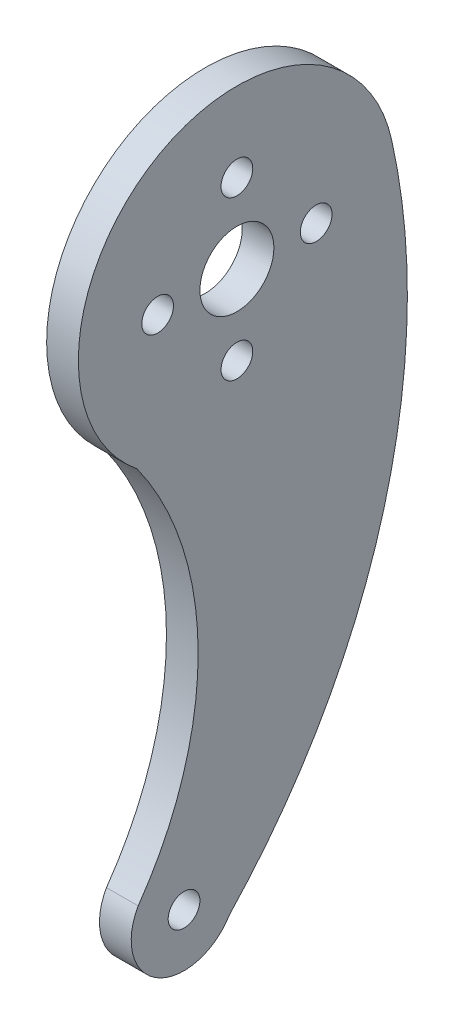
ISO-10303-21;
HEADER;
FILE_DESCRIPTION(('STEP AP214'),'2;1');
FILE_NAME('part.step','',(''),(''),'','','');
FILE_SCHEMA(('AUTOMOTIVE_DESIGN { 1 0 10303 214 1 1 1 1 }'));
ENDSEC;
DATA;
#1=APPLICATION_CONTEXT('core data for automotive mechanical design processes');
#2=APPLICATION_PROTOCOL_DEFINITION('international standard','automotive_design',2000,#1);
#3=PRODUCT_CONTEXT('',#1,'mechanical');
#4=PRODUCT('Part','Part','',(#3));
#5=PRODUCT_RELATED_PRODUCT_CATEGORY('part','',(#4));
#6=PRODUCT_DEFINITION_FORMATION('','',#4);
#7=PRODUCT_DEFINITION_CONTEXT('part definition',#1,'design');
#8=PRODUCT_DEFINITION('design','',#6,#7);
#9=PRODUCT_DEFINITION_SHAPE('','',#8);
#10=(LENGTH_UNIT() NAMED_UNIT(*) SI_UNIT(.MILLI.,.METRE.));
#11=(NAMED_UNIT(*) PLANE_ANGLE_UNIT() SI_UNIT($,.RADIAN.));
#12=(NAMED_UNIT(*) SI_UNIT($,.STERADIAN.) SOLID_ANGLE_UNIT());
#13=UNCERTAINTY_MEASURE_WITH_UNIT(LENGTH_MEASURE(1.E-05),#10,'distance_accuracy_value','');
#14=(GEOMETRIC_REPRESENTATION_CONTEXT(3) GLOBAL_UNCERTAINTY_ASSIGNED_CONTEXT((#13)) GLOBAL_UNIT_ASSIGNED_CONTEXT((#10,
#11,#12)) REPRESENTATION_CONTEXT('',''));
#15=CARTESIAN_POINT('',(0.,0.,0.));
#16=DIRECTION('',(0.,0.,1.));
#17=DIRECTION('',(1.,0.,0.));
#18=AXIS2_PLACEMENT_3D('',#15,#16,#17);
#19=CARTESIAN_POINT('',(3.,-14.8299747003115,17.3003797586799));
#20=DIRECTION('',(1.,0.,0.));
#21=DIRECTION('',(0.,0.,-1.));
#22=AXIS2_PLACEMENT_3D('',#19,#20,#21);
#23=PLANE('',#22);
#24=CARTESIAN_POINT('',(3.,0.,-7.5));
#25=DIRECTION('',(1.,0.,0.));
#26=DIRECTION('',(0.,0.,-1.));
#27=AXIS2_PLACEMENT_3D('',#24,#25,#26);
#28=CIRCLE('',#27,1.5);
#29=CARTESIAN_POINT('',(3.,0.,-9.));
#30=VERTEX_POINT('',#29);
#31=EDGE_CURVE('E132',#30,#30,#28,.T.);
#32=ORIENTED_EDGE('',*,*,#31,.F.);
#33=EDGE_LOOP('',(#32));
#34=FACE_BOUND('',#33,.T.);
#35=CARTESIAN_POINT('',(3.,0.,7.5));
#36=DIRECTION('',(1.,0.,0.));
#37=DIRECTION('',(0.,0.,-1.));
#38=AXIS2_PLACEMENT_3D('',#35,#36,#37);
#39=CIRCLE('',#38,1.5);
#40=CARTESIAN_POINT('',(3.,0.,6.));
#41=VERTEX_POINT('',#40);
#42=EDGE_CURVE('E120',#41,#41,#39,.T.);
#43=ORIENTED_EDGE('',*,*,#42,.F.);
#44=EDGE_LOOP('',(#43));
#45=FACE_BOUND('',#44,.T.);
#46=CARTESIAN_POINT('',(3.,0.,0.));
#47=DIRECTION('',(1.,0.,0.));
#48=DIRECTION('',(0.,0.,-1.));
#49=AXIS2_PLACEMENT_3D('',#46,#47,#48);
#50=CIRCLE('',#49,3.5);
#51=CARTESIAN_POINT('',(3.,0.,-3.5));
#52=VERTEX_POINT('',#51);
#53=EDGE_CURVE('E99',#52,#52,#50,.T.);
#54=ORIENTED_EDGE('',*,*,#53,.F.);
#55=EDGE_LOOP('',(#54));
#56=FACE_BOUND('',#55,.T.);
#57=CARTESIAN_POINT('',(3.,-29.659949400623,34.6007595173598));
#58=DIRECTION('',(-1.,0.,0.));
#59=DIRECTION('',(0.,0.,-1.));
#60=AXIS2_PLACEMENT_3D('',#57,#58,#59);
#61=CIRCLE('',#60,30.9348802246162);
#62=CARTESIAN_POINT('',(3.,-11.649280310313,9.44956444772743));
#63=VERTEX_POINT('',#62);
#64=CARTESIAN_POINT('',(3.,-47.5142601565081,9.33832887532466));
#65=VERTEX_POINT('',#64);
#66=EDGE_CURVE('E84',#63,#65,#61,.T.);
#67=ORIENTED_EDGE('',*,*,#66,.T.);
#68=CARTESIAN_POINT('',(3.,-50.,4.99999999999987));
#69=DIRECTION('',(1.,0.,0.));
#70=DIRECTION('',(0.,0.,-1.));
#71=AXIS2_PLACEMENT_3D('',#68,#69,#70);
#72=CIRCLE('',#71,5.);
#73=CARTESIAN_POINT('',(3.,-52.5694897812166,0.710743390256941));
#74=VERTEX_POINT('',#73);
#75=EDGE_CURVE('E79',#65,#74,#72,.T.);
#76=ORIENTED_EDGE('',*,*,#75,.T.);
#77=CARTESIAN_POINT('',(3.,-10.2016384064253,45.5953037460277));
#78=DIRECTION('',(1.,0.,0.));
#79=DIRECTION('',(0.,0.,1.));
#80=AXIS2_PLACEMENT_3D('',#77,#78,#79);
#81=CIRCLE('',#80,61.7224318092477);
#82=CARTESIAN_POINT('',(3.,3.18632775266012,-14.6576708740723));
#83=VERTEX_POINT('',#82);
#84=EDGE_CURVE('E82',#74,#83,#81,.T.);
#85=ORIENTED_EDGE('',*,*,#84,.T.);
#86=CARTESIAN_POINT('',(3.,0.,0.));
#87=DIRECTION('',(1.,0.,0.));
#88=DIRECTION('',(0.,0.,-1.));
#89=AXIS2_PLACEMENT_3D('',#86,#87,#88);
#90=CIRCLE('',#89,15.);
#91=EDGE_CURVE('E49',#83,#63,#90,.T.);
#92=ORIENTED_EDGE('',*,*,#91,.T.);
#93=EDGE_LOOP('',(#67,#76,#85,#92));
#94=FACE_BOUND('',#93,.T.);
#95=CARTESIAN_POINT('',(3.,-50.,4.99999999999987));
#96=DIRECTION('',(1.,0.,0.));
#97=DIRECTION('',(0.,0.,-1.));
#98=AXIS2_PLACEMENT_3D('',#95,#96,#97);
#99=CIRCLE('',#98,1.5);
#100=CARTESIAN_POINT('',(3.,-50.,3.49999999999987));
#101=VERTEX_POINT('',#100);
#102=EDGE_CURVE('E114',#101,#101,#99,.T.);
#103=ORIENTED_EDGE('',*,*,#102,.F.);
#104=EDGE_LOOP('',(#103));
#105=FACE_BOUND('',#104,.T.);
#106=CARTESIAN_POINT('',(3.,7.5,0.));
#107=DIRECTION('',(1.,0.,0.));
#108=DIRECTION('',(0.,0.,-1.));
#109=AXIS2_PLACEMENT_3D('',#106,#107,#108);
#110=CIRCLE('',#109,1.5);
#111=CARTESIAN_POINT('',(3.,7.5,-1.5));
#112=VERTEX_POINT('',#111);
#113=EDGE_CURVE('E126',#112,#112,#110,.T.);
#114=ORIENTED_EDGE('',*,*,#113,.F.);
#115=EDGE_LOOP('',(#114));
#116=FACE_BOUND('',#115,.T.);
#117=CARTESIAN_POINT('',(3.,-7.5,0.));
#118=DIRECTION('',(1.,0.,0.));
#119=DIRECTION('',(0.,0.,-1.));
#120=AXIS2_PLACEMENT_3D('',#117,#118,#119);
#121=CIRCLE('',#120,1.5);
#122=CARTESIAN_POINT('',(3.,-7.5,-1.5));
#123=VERTEX_POINT('',#122);
#124=EDGE_CURVE('E138',#123,#123,#121,.T.);
#125=ORIENTED_EDGE('',*,*,#124,.F.);
#126=EDGE_LOOP('',(#125));
#127=FACE_BOUND('',#126,.T.);
#128=ADVANCED_FACE('F32',(#34,#45,#56,#94,#105,#116,#127),#23,.T.);
#129=CARTESIAN_POINT('',(0.,-14.8299747003115,17.3003797586799));
#130=DIRECTION('',(1.,0.,0.));
#131=DIRECTION('',(0.,0.,-1.));
#132=AXIS2_PLACEMENT_3D('',#129,#130,#131);
#133=PLANE('',#132);
#134=CARTESIAN_POINT('',(0.,0.,-7.5));
#135=DIRECTION('',(1.,0.,0.));
#136=DIRECTION('',(0.,0.,-1.));
#137=AXIS2_PLACEMENT_3D('',#134,#135,#136);
#138=CIRCLE('',#137,1.5);
#139=CARTESIAN_POINT('',(0.,0.,-9.));
#140=VERTEX_POINT('',#139);
#141=EDGE_CURVE('E135',#140,#140,#138,.T.);
#142=ORIENTED_EDGE('',*,*,#141,.T.);
#143=EDGE_LOOP('',(#142));
#144=FACE_BOUND('',#143,.T.);
#145=CARTESIAN_POINT('',(0.,0.,7.5));
#146=DIRECTION('',(1.,0.,0.));
#147=DIRECTION('',(0.,0.,-1.));
#148=AXIS2_PLACEMENT_3D('',#145,#146,#147);
#149=CIRCLE('',#148,1.5);
#150=CARTESIAN_POINT('',(0.,0.,6.));
#151=VERTEX_POINT('',#150);
#152=EDGE_CURVE('E123',#151,#151,#149,.T.);
#153=ORIENTED_EDGE('',*,*,#152,.T.);
#154=EDGE_LOOP('',(#153));
#155=FACE_BOUND('',#154,.T.);
#156=CARTESIAN_POINT('',(0.,0.,0.));
#157=DIRECTION('',(1.,0.,0.));
#158=DIRECTION('',(0.,0.,-1.));
#159=AXIS2_PLACEMENT_3D('',#156,#157,#158);
#160=CIRCLE('',#159,3.5);
#161=CARTESIAN_POINT('',(0.,0.,-3.5));
#162=VERTEX_POINT('',#161);
#163=EDGE_CURVE('E111',#162,#162,#160,.T.);
#164=ORIENTED_EDGE('',*,*,#163,.T.);
#165=EDGE_LOOP('',(#164));
#166=FACE_BOUND('',#165,.T.);
#167=CARTESIAN_POINT('',(0.,-29.659949400623,34.6007595173598));
#168=DIRECTION('',(-1.,0.,0.));
#169=DIRECTION('',(0.,0.,-1.));
#170=AXIS2_PLACEMENT_3D('',#167,#168,#169);
#171=CIRCLE('',#170,30.9348802246162);
#172=CARTESIAN_POINT('',(0.,-11.649280310313,9.44956444772743));
#173=VERTEX_POINT('',#172);
#174=CARTESIAN_POINT('',(0.,-47.5142601565081,9.33832887532466));
#175=VERTEX_POINT('',#174);
#176=EDGE_CURVE('E96',#173,#175,#171,.T.);
#177=ORIENTED_EDGE('',*,*,#176,.F.);
#178=CARTESIAN_POINT('',(0.,0.,0.));
#179=DIRECTION('',(1.,0.,0.));
#180=DIRECTION('',(0.,0.,-1.));
#181=AXIS2_PLACEMENT_3D('',#178,#179,#180);
#182=CIRCLE('',#181,15.);
#183=CARTESIAN_POINT('',(0.,3.18632775266012,-14.6576708740723));
#184=VERTEX_POINT('',#183);
#185=EDGE_CURVE('E72',#184,#173,#182,.T.);
#186=ORIENTED_EDGE('',*,*,#185,.F.);
#187=CARTESIAN_POINT('',(0.,-10.2016384064253,45.5953037460277));
#188=DIRECTION('',(1.,0.,0.));
#189=DIRECTION('',(0.,0.,1.));
#190=AXIS2_PLACEMENT_3D('',#187,#188,#189);
#191=CIRCLE('',#190,61.7224318092477);
#192=CARTESIAN_POINT('',(0.,-52.5694897812166,0.710743390256941));
#193=VERTEX_POINT('',#192);
#194=EDGE_CURVE('E66',#193,#184,#191,.T.);
#195=ORIENTED_EDGE('',*,*,#194,.F.);
#196=CARTESIAN_POINT('',(0.,-50.,4.99999999999987));
#197=DIRECTION('',(1.,0.,0.));
#198=DIRECTION('',(0.,0.,-1.));
#199=AXIS2_PLACEMENT_3D('',#196,#197,#198);
#200=CIRCLE('',#199,5.);
#201=EDGE_CURVE('E88',#175,#193,#200,.T.);
#202=ORIENTED_EDGE('',*,*,#201,.F.);
#203=EDGE_LOOP('',(#177,#186,#195,#202));
#204=FACE_BOUND('',#203,.T.);
#205=CARTESIAN_POINT('',(0.,-50.,4.99999999999987));
#206=DIRECTION('',(1.,0.,0.));
#207=DIRECTION('',(0.,0.,-1.));
#208=AXIS2_PLACEMENT_3D('',#205,#206,#207);
#209=CIRCLE('',#208,1.5);
#210=CARTESIAN_POINT('',(0.,-50.,3.49999999999987));
#211=VERTEX_POINT('',#210);
#212=EDGE_CURVE('E117',#211,#211,#209,.T.);
#213=ORIENTED_EDGE('',*,*,#212,.T.);
#214=EDGE_LOOP('',(#213));
#215=FACE_BOUND('',#214,.T.);
#216=CARTESIAN_POINT('',(0.,7.5,0.));
#217=DIRECTION('',(1.,0.,0.));
#218=DIRECTION('',(0.,0.,-1.));
#219=AXIS2_PLACEMENT_3D('',#216,#217,#218);
#220=CIRCLE('',#219,1.5);
#221=CARTESIAN_POINT('',(0.,7.5,-1.5));
#222=VERTEX_POINT('',#221);
#223=EDGE_CURVE('E129',#222,#222,#220,.T.);
#224=ORIENTED_EDGE('',*,*,#223,.T.);
#225=EDGE_LOOP('',(#224));
#226=FACE_BOUND('',#225,.T.);
#227=CARTESIAN_POINT('',(0.,-7.5,0.));
#228=DIRECTION('',(1.,0.,0.));
#229=DIRECTION('',(0.,0.,-1.));
#230=AXIS2_PLACEMENT_3D('',#227,#228,#229);
#231=CIRCLE('',#230,1.5);
#232=CARTESIAN_POINT('',(0.,-7.5,-1.5));
#233=VERTEX_POINT('',#232);
#234=EDGE_CURVE('E141',#233,#233,#231,.T.);
#235=ORIENTED_EDGE('',*,*,#234,.T.);
#236=EDGE_LOOP('',(#235));
#237=FACE_BOUND('',#236,.T.);
#238=ADVANCED_FACE('F107',(#144,#155,#166,#204,#215,#226,#237),#133,.F.);
#239=CARTESIAN_POINT('',(3.,-29.659949400623,34.6007595173598));
#240=DIRECTION('',(-1.,0.,0.));
#241=DIRECTION('',(0.,0.,1.));
#242=AXIS2_PLACEMENT_3D('',#239,#240,#241);
#243=CYLINDRICAL_SURFACE('',#242,30.9348802246162);
#244=ORIENTED_EDGE('',*,*,#176,.T.);
#245=DIRECTION('',(-1.,0.,0.));
#246=VECTOR('',#245,1.);
#247=CARTESIAN_POINT('',(3.,-47.5142601565081,9.33832887532466));
#248=LINE('',#247,#246);
#249=EDGE_CURVE('E11',#65,#175,#248,.T.);
#250=ORIENTED_EDGE('',*,*,#249,.F.);
#251=ORIENTED_EDGE('',*,*,#66,.F.);
#252=DIRECTION('',(-1.,0.,0.));
#253=VECTOR('',#252,1.);
#254=CARTESIAN_POINT('',(3.,-11.649280310313,9.44956444772743));
#255=LINE('',#254,#253);
#256=EDGE_CURVE('E92',#63,#173,#255,.T.);
#257=ORIENTED_EDGE('',*,*,#256,.T.);
#258=EDGE_LOOP('',(#244,#250,#251,#257));
#259=FACE_BOUND('',#258,.T.);
#260=ADVANCED_FACE('F34',(#259),#243,.F.);
#261=CARTESIAN_POINT('',(3.,-50.,4.99999999999987));
#262=DIRECTION('',(-1.,0.,0.));
#263=DIRECTION('',(0.,0.,1.));
#264=AXIS2_PLACEMENT_3D('',#261,#262,#263);
#265=CYLINDRICAL_SURFACE('',#264,5.);
#266=ORIENTED_EDGE('',*,*,#201,.T.);
#267=DIRECTION('',(-1.,0.,0.));
#268=VECTOR('',#267,1.);
#269=CARTESIAN_POINT('',(3.,-52.5694897812166,0.710743390256941));
#270=LINE('',#269,#268);
#271=EDGE_CURVE('E41',#74,#193,#270,.T.);
#272=ORIENTED_EDGE('',*,*,#271,.F.);
#273=ORIENTED_EDGE('',*,*,#75,.F.);
#274=ORIENTED_EDGE('',*,*,#249,.T.);
#275=EDGE_LOOP('',(#266,#272,#273,#274));
#276=FACE_BOUND('',#275,.T.);
#277=ADVANCED_FACE('F87',(#276),#265,.T.);
#278=CARTESIAN_POINT('',(3.,-10.2016384064253,45.5953037460277));
#279=DIRECTION('',(-1.,0.,0.));
#280=DIRECTION('',(0.,0.,1.));
#281=AXIS2_PLACEMENT_3D('',#278,#279,#280);
#282=CYLINDRICAL_SURFACE('',#281,61.7224318092477);
#283=ORIENTED_EDGE('',*,*,#194,.T.);
#284=DIRECTION('',(-1.,0.,0.));
#285=VECTOR('',#284,1.);
#286=CARTESIAN_POINT('',(3.,3.18632775266012,-14.6576708740723));
#287=LINE('',#286,#285);
#288=EDGE_CURVE('E89',#83,#184,#287,.T.);
#289=ORIENTED_EDGE('',*,*,#288,.F.);
#290=ORIENTED_EDGE('',*,*,#84,.F.);
#291=ORIENTED_EDGE('',*,*,#271,.T.);
#292=EDGE_LOOP('',(#283,#289,#290,#291));
#293=FACE_BOUND('',#292,.T.);
#294=ADVANCED_FACE('F90',(#293),#282,.T.);
#295=CARTESIAN_POINT('',(3.,0.,0.));
#296=DIRECTION('',(-1.,0.,0.));
#297=DIRECTION('',(0.,0.,1.));
#298=AXIS2_PLACEMENT_3D('',#295,#296,#297);
#299=CYLINDRICAL_SURFACE('',#298,15.);
#300=ORIENTED_EDGE('',*,*,#185,.T.);
#301=ORIENTED_EDGE('',*,*,#256,.F.);
#302=ORIENTED_EDGE('',*,*,#91,.F.);
#303=ORIENTED_EDGE('',*,*,#288,.T.);
#304=EDGE_LOOP('',(#300,#301,#302,#303));
#305=FACE_BOUND('',#304,.T.);
#306=ADVANCED_FACE('F104',(#305),#299,.T.);
#307=CARTESIAN_POINT('',(3.,0.,0.));
#308=DIRECTION('',(-1.,0.,0.));
#309=DIRECTION('',(0.,0.,1.));
#310=AXIS2_PLACEMENT_3D('',#307,#308,#309);
#311=CYLINDRICAL_SURFACE('',#310,3.5);
#312=ORIENTED_EDGE('',*,*,#53,.T.);
#313=EDGE_LOOP('',(#312));
#314=FACE_BOUND('',#313,.T.);
#315=ORIENTED_EDGE('',*,*,#163,.F.);
#316=EDGE_LOOP('',(#315));
#317=FACE_BOUND('',#316,.T.);
#318=ADVANCED_FACE('F161',(#314,#317),#311,.F.);
#319=CARTESIAN_POINT('',(3.,-50.,4.99999999999987));
#320=DIRECTION('',(-1.,0.,0.));
#321=DIRECTION('',(0.,0.,1.));
#322=AXIS2_PLACEMENT_3D('',#319,#320,#321);
#323=CYLINDRICAL_SURFACE('',#322,1.5);
#324=ORIENTED_EDGE('',*,*,#102,.T.);
#325=EDGE_LOOP('',(#324));
#326=FACE_BOUND('',#325,.T.);
#327=ORIENTED_EDGE('',*,*,#212,.F.);
#328=EDGE_LOOP('',(#327));
#329=FACE_BOUND('',#328,.T.);
#330=ADVANCED_FACE('F207',(#326,#329),#323,.F.);
#331=CARTESIAN_POINT('',(3.,0.,7.5));
#332=DIRECTION('',(-1.,0.,0.));
#333=DIRECTION('',(0.,0.,1.));
#334=AXIS2_PLACEMENT_3D('',#331,#332,#333);
#335=CYLINDRICAL_SURFACE('',#334,1.5);
#336=ORIENTED_EDGE('',*,*,#42,.T.);
#337=EDGE_LOOP('',(#336));
#338=FACE_BOUND('',#337,.T.);
#339=ORIENTED_EDGE('',*,*,#152,.F.);
#340=EDGE_LOOP('',(#339));
#341=FACE_BOUND('',#340,.T.);
#342=ADVANCED_FACE('F215',(#338,#341),#335,.F.);
#343=CARTESIAN_POINT('',(3.,7.5,0.));
#344=DIRECTION('',(-1.,0.,0.));
#345=DIRECTION('',(0.,0.,1.));
#346=AXIS2_PLACEMENT_3D('',#343,#344,#345);
#347=CYLINDRICAL_SURFACE('',#346,1.5);
#348=ORIENTED_EDGE('',*,*,#113,.T.);
#349=EDGE_LOOP('',(#348));
#350=FACE_BOUND('',#349,.T.);
#351=ORIENTED_EDGE('',*,*,#223,.F.);
#352=EDGE_LOOP('',(#351));
#353=FACE_BOUND('',#352,.T.);
#354=ADVANCED_FACE('F223',(#350,#353),#347,.F.);
#355=CARTESIAN_POINT('',(3.,0.,-7.5));
#356=DIRECTION('',(-1.,0.,0.));
#357=DIRECTION('',(0.,0.,1.));
#358=AXIS2_PLACEMENT_3D('',#355,#356,#357);
#359=CYLINDRICAL_SURFACE('',#358,1.5);
#360=ORIENTED_EDGE('',*,*,#31,.T.);
#361=EDGE_LOOP('',(#360));
#362=FACE_BOUND('',#361,.T.);
#363=ORIENTED_EDGE('',*,*,#141,.F.);
#364=EDGE_LOOP('',(#363));
#365=FACE_BOUND('',#364,.T.);
#366=ADVANCED_FACE('F232',(#362,#365),#359,.F.);
#367=CARTESIAN_POINT('',(3.,-7.5,0.));
#368=DIRECTION('',(-1.,0.,0.));
#369=DIRECTION('',(0.,0.,1.));
#370=AXIS2_PLACEMENT_3D('',#367,#368,#369);
#371=CYLINDRICAL_SURFACE('',#370,1.5);
#372=ORIENTED_EDGE('',*,*,#124,.T.);
#373=EDGE_LOOP('',(#372));
#374=FACE_BOUND('',#373,.T.);
#375=ORIENTED_EDGE('',*,*,#234,.F.);
#376=EDGE_LOOP('',(#375));
#377=FACE_BOUND('',#376,.T.);
#378=ADVANCED_FACE('F147',(#374,#377),#371,.F.);
#379=CLOSED_SHELL('',(#128,#238,#260,#277,#294,#306,#318,#330,#342,#354,#366,#378));
#380=MANIFOLD_SOLID_BREP('B2',#379);
#381=ADVANCED_BREP_SHAPE_REPRESENTATION('',(#18,#380),#14);
#382=SHAPE_DEFINITION_REPRESENTATION(#9,#381);
ENDSEC;
END-ISO-10303-21;
